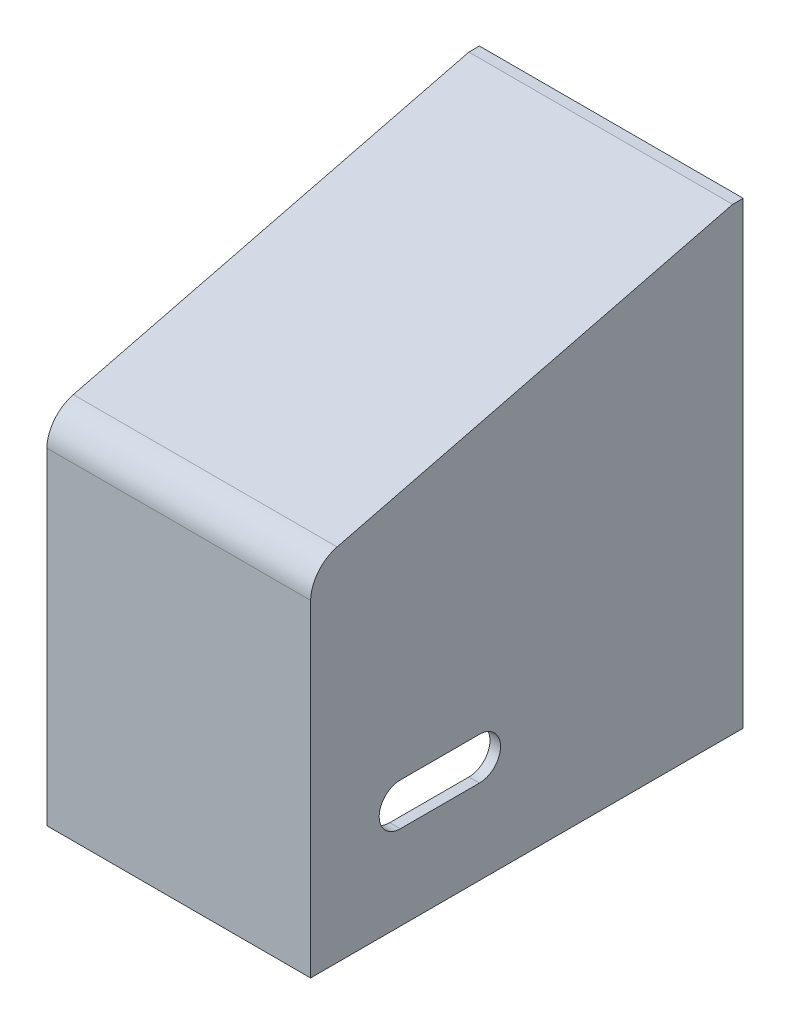
ISO-10303-21;
HEADER;
FILE_DESCRIPTION(('STEP AP214'),'2;1');
FILE_NAME('part.step','',(''),(''),'','','');
FILE_SCHEMA(('AUTOMOTIVE_DESIGN { 1 0 10303 214 1 1 1 1 }'));
ENDSEC;
DATA;
#1=APPLICATION_CONTEXT('core data for automotive mechanical design processes');
#2=APPLICATION_PROTOCOL_DEFINITION('international standard','automotive_design',2000,#1);
#3=PRODUCT_CONTEXT('',#1,'mechanical');
#4=PRODUCT('Part','Part','',(#3));
#5=PRODUCT_RELATED_PRODUCT_CATEGORY('part','',(#4));
#6=PRODUCT_DEFINITION_FORMATION('','',#4);
#7=PRODUCT_DEFINITION_CONTEXT('part definition',#1,'design');
#8=PRODUCT_DEFINITION('design','',#6,#7);
#9=PRODUCT_DEFINITION_SHAPE('','',#8);
#10=(LENGTH_UNIT() NAMED_UNIT(*) SI_UNIT(.MILLI.,.METRE.));
#11=(NAMED_UNIT(*) PLANE_ANGLE_UNIT() SI_UNIT($,.RADIAN.));
#12=(NAMED_UNIT(*) SI_UNIT($,.STERADIAN.) SOLID_ANGLE_UNIT());
#13=UNCERTAINTY_MEASURE_WITH_UNIT(LENGTH_MEASURE(1.E-05),#10,'distance_accuracy_value','');
#14=(GEOMETRIC_REPRESENTATION_CONTEXT(3) GLOBAL_UNCERTAINTY_ASSIGNED_CONTEXT((#13)) GLOBAL_UNIT_ASSIGNED_CONTEXT((#10,
#11,#12)) REPRESENTATION_CONTEXT('',''));
#15=CARTESIAN_POINT('',(0.,0.,0.));
#16=DIRECTION('',(0.,0.,1.));
#17=DIRECTION('',(1.,0.,0.));
#18=AXIS2_PLACEMENT_3D('',#15,#16,#17);
#19=CARTESIAN_POINT('',(0.,0.,2.));
#20=DIRECTION('',(0.,0.,-1.));
#21=DIRECTION('',(-1.,0.,0.));
#22=AXIS2_PLACEMENT_3D('',#19,#20,#21);
#23=PLANE('',#22);
#24=DIRECTION('',(0.,-1.,0.));
#25=VECTOR('',#24,1.);
#26=CARTESIAN_POINT('',(-2.,0.,2.));
#27=LINE('',#26,#25);
#28=CARTESIAN_POINT('',(-2.,85.,2.));
#29=VERTEX_POINT('',#28);
#30=CARTESIAN_POINT('',(-2.,0.,2.));
#31=VERTEX_POINT('',#30);
#32=EDGE_CURVE('E147',#29,#31,#27,.T.);
#33=ORIENTED_EDGE('',*,*,#32,.F.);
#34=DIRECTION('',(-1.,0.,0.));
#35=VECTOR('',#34,1.);
#36=CARTESIAN_POINT('',(0.,85.,2.));
#37=LINE('',#36,#35);
#38=CARTESIAN_POINT('',(0.,85.,2.));
#39=VERTEX_POINT('',#38);
#40=EDGE_CURVE('E12',#39,#29,#37,.T.);
#41=ORIENTED_EDGE('',*,*,#40,.F.);
#42=DIRECTION('',(0.,-1.,0.));
#43=VECTOR('',#42,1.);
#44=CARTESIAN_POINT('',(0.,0.,2.));
#45=LINE('',#44,#43);
#46=CARTESIAN_POINT('',(0.,0.,2.));
#47=VERTEX_POINT('',#46);
#48=EDGE_CURVE('E148',#39,#47,#45,.T.);
#49=ORIENTED_EDGE('',*,*,#48,.T.);
#50=DIRECTION('',(-1.,0.,0.));
#51=VECTOR('',#50,1.);
#52=CARTESIAN_POINT('',(0.,0.,2.));
#53=LINE('',#52,#51);
#54=EDGE_CURVE('E48',#47,#31,#53,.T.);
#55=ORIENTED_EDGE('',*,*,#54,.T.);
#56=EDGE_LOOP('',(#33,#41,#49,#55));
#57=FACE_BOUND('',#56,.T.);
#58=ADVANCED_FACE('F45',(#57),#23,.T.);
#59=CARTESIAN_POINT('',(0.,85.,2.));
#60=DIRECTION('',(0.,0.970142500145332,0.242535625036333));
#61=DIRECTION('',(0.,-0.242535625036333,0.970142500145332));
#62=AXIS2_PLACEMENT_3D('',#59,#60,#61);
#63=PLANE('',#62);
#64=DIRECTION('',(0.,0.242535625036333,-0.970142500145332));
#65=VECTOR('',#64,1.);
#66=CARTESIAN_POINT('',(-2.,85.,2.));
#67=LINE('',#66,#65);
#68=CARTESIAN_POINT('',(-2.,65.5,80.));
#69=VERTEX_POINT('',#68);
#70=EDGE_CURVE('E152',#69,#29,#67,.T.);
#71=ORIENTED_EDGE('',*,*,#70,.F.);
#72=DIRECTION('',(-1.,0.,0.));
#73=VECTOR('',#72,1.);
#74=CARTESIAN_POINT('',(0.,65.5,80.));
#75=LINE('',#74,#73);
#76=CARTESIAN_POINT('',(0.,65.5,80.));
#77=VERTEX_POINT('',#76);
#78=EDGE_CURVE('E53',#77,#69,#75,.T.);
#79=ORIENTED_EDGE('',*,*,#78,.F.);
#80=DIRECTION('',(0.,0.242535625036333,-0.970142500145332));
#81=VECTOR('',#80,1.);
#82=CARTESIAN_POINT('',(0.,85.,2.));
#83=LINE('',#82,#81);
#84=EDGE_CURVE('E158',#77,#39,#83,.T.);
#85=ORIENTED_EDGE('',*,*,#84,.T.);
#86=ORIENTED_EDGE('',*,*,#40,.T.);
#87=EDGE_LOOP('',(#71,#79,#85,#86));
#88=FACE_BOUND('',#87,.T.);
#89=ADVANCED_FACE('F182',(#88),#63,.T.);
#90=CARTESIAN_POINT('',(0.,65.5,80.));
#91=DIRECTION('',(0.,0.,1.));
#92=DIRECTION('',(1.,0.,0.));
#93=AXIS2_PLACEMENT_3D('',#90,#91,#92);
#94=PLANE('',#93);
#95=DIRECTION('',(0.,1.,0.));
#96=VECTOR('',#95,1.);
#97=CARTESIAN_POINT('',(-2.,65.5,80.));
#98=LINE('',#97,#96);
#99=CARTESIAN_POINT('',(-2.,0.,80.));
#100=VERTEX_POINT('',#99);
#101=EDGE_CURVE('E166',#100,#69,#98,.T.);
#102=ORIENTED_EDGE('',*,*,#101,.F.);
#103=DIRECTION('',(-1.,0.,0.));
#104=VECTOR('',#103,1.);
#105=CARTESIAN_POINT('',(0.,0.,80.));
#106=LINE('',#105,#104);
#107=CARTESIAN_POINT('',(0.,0.,80.));
#108=VERTEX_POINT('',#107);
#109=EDGE_CURVE('E171',#108,#100,#106,.T.);
#110=ORIENTED_EDGE('',*,*,#109,.F.);
#111=DIRECTION('',(0.,1.,0.));
#112=VECTOR('',#111,1.);
#113=CARTESIAN_POINT('',(0.,65.5,80.));
#114=LINE('',#113,#112);
#115=EDGE_CURVE('E155',#108,#77,#114,.T.);
#116=ORIENTED_EDGE('',*,*,#115,.T.);
#117=ORIENTED_EDGE('',*,*,#78,.T.);
#118=EDGE_LOOP('',(#102,#110,#116,#117));
#119=FACE_BOUND('',#118,.T.);
#120=ADVANCED_FACE('F188',(#119),#94,.T.);
#121=CARTESIAN_POINT('',(0.,0.,80.));
#122=DIRECTION('',(0.,-1.,0.));
#123=DIRECTION('',(0.,0.,-1.));
#124=AXIS2_PLACEMENT_3D('',#121,#122,#123);
#125=PLANE('',#124);
#126=DIRECTION('',(0.,0.,1.));
#127=VECTOR('',#126,1.);
#128=CARTESIAN_POINT('',(-2.,0.,80.));
#129=LINE('',#128,#127);
#130=EDGE_CURVE('E163',#31,#100,#129,.T.);
#131=ORIENTED_EDGE('',*,*,#130,.F.);
#132=ORIENTED_EDGE('',*,*,#54,.F.);
#133=DIRECTION('',(0.,0.,1.));
#134=VECTOR('',#133,1.);
#135=CARTESIAN_POINT('',(0.,0.,80.));
#136=LINE('',#135,#134);
#137=EDGE_CURVE('E151',#47,#108,#136,.T.);
#138=ORIENTED_EDGE('',*,*,#137,.T.);
#139=ORIENTED_EDGE('',*,*,#109,.T.);
#140=EDGE_LOOP('',(#131,#132,#138,#139));
#141=FACE_BOUND('',#140,.T.);
#142=ADVANCED_FACE('F179',(#141),#125,.T.);
#143=CARTESIAN_POINT('',(0.,0.,0.));
#144=DIRECTION('',(-1.,0.,0.));
#145=DIRECTION('',(0.,0.,1.));
#146=AXIS2_PLACEMENT_3D('',#143,#144,#145);
#147=PLANE('',#146);
#148=DIRECTION('',(0.,0.,-1.));
#149=VECTOR('',#148,1.);
#150=CARTESIAN_POINT('',(0.,24.,0.));
#151=LINE('',#150,#149);
#152=CARTESIAN_POINT('',(0.,24.,65.));
#153=VERTEX_POINT('',#152);
#154=CARTESIAN_POINT('',(0.,24.,50.));
#155=VERTEX_POINT('',#154);
#156=EDGE_CURVE('E141',#153,#155,#151,.T.);
#157=ORIENTED_EDGE('',*,*,#156,.T.);
#158=CARTESIAN_POINT('',(0.,20.,50.));
#159=DIRECTION('',(-1.,0.,0.));
#160=DIRECTION('',(0.,0.,1.));
#161=AXIS2_PLACEMENT_3D('',#158,#159,#160);
#162=CIRCLE('',#161,4.00000000000001);
#163=CARTESIAN_POINT('',(0.,16.,50.));
#164=VERTEX_POINT('',#163);
#165=EDGE_CURVE('E144',#155,#164,#162,.T.);
#166=ORIENTED_EDGE('',*,*,#165,.T.);
#167=DIRECTION('',(0.,0.,1.));
#168=VECTOR('',#167,1.);
#169=CARTESIAN_POINT('',(0.,16.,0.));
#170=LINE('',#169,#168);
#171=CARTESIAN_POINT('',(0.,16.,65.));
#172=VERTEX_POINT('',#171);
#173=EDGE_CURVE('E136',#164,#172,#170,.T.);
#174=ORIENTED_EDGE('',*,*,#173,.T.);
#175=CARTESIAN_POINT('',(0.,20.,65.));
#176=DIRECTION('',(-1.,0.,0.));
#177=DIRECTION('',(0.,0.,1.));
#178=AXIS2_PLACEMENT_3D('',#175,#176,#177);
#179=CIRCLE('',#178,4.00000000000001);
#180=EDGE_CURVE('E116',#172,#153,#179,.T.);
#181=ORIENTED_EDGE('',*,*,#180,.T.);
#182=EDGE_LOOP('',(#157,#166,#174,#181));
#183=FACE_BOUND('',#182,.T.);
#184=ORIENTED_EDGE('',*,*,#48,.F.);
#185=ORIENTED_EDGE('',*,*,#84,.F.);
#186=ORIENTED_EDGE('',*,*,#115,.F.);
#187=ORIENTED_EDGE('',*,*,#137,.F.);
#188=EDGE_LOOP('',(#184,#185,#186,#187));
#189=FACE_BOUND('',#188,.T.);
#190=ADVANCED_FACE('F185',(#183,#189),#147,.F.);
#191=CARTESIAN_POINT('',(-2.,0.,0.));
#192=DIRECTION('',(-1.,0.,0.));
#193=DIRECTION('',(0.,0.,1.));
#194=AXIS2_PLACEMENT_3D('',#191,#192,#193);
#195=PLANE('',#194);
#196=CARTESIAN_POINT('',(-2.,20.,50.));
#197=DIRECTION('',(-1.,0.,0.));
#198=DIRECTION('',(0.,0.,1.));
#199=AXIS2_PLACEMENT_3D('',#196,#197,#198);
#200=CIRCLE('',#199,4.00000000000001);
#201=CARTESIAN_POINT('',(-2.,24.,50.));
#202=VERTEX_POINT('',#201);
#203=CARTESIAN_POINT('',(-2.,16.,50.));
#204=VERTEX_POINT('',#203);
#205=EDGE_CURVE('E69',#202,#204,#200,.T.);
#206=ORIENTED_EDGE('',*,*,#205,.F.);
#207=DIRECTION('',(0.,0.,-1.));
#208=VECTOR('',#207,1.);
#209=CARTESIAN_POINT('',(-2.,24.,50.));
#210=LINE('',#209,#208);
#211=CARTESIAN_POINT('',(-2.,24.,65.));
#212=VERTEX_POINT('',#211);
#213=EDGE_CURVE('E129',#212,#202,#210,.T.);
#214=ORIENTED_EDGE('',*,*,#213,.F.);
#215=CARTESIAN_POINT('',(-2.,20.,65.));
#216=DIRECTION('',(-1.,0.,0.));
#217=DIRECTION('',(0.,0.,1.));
#218=AXIS2_PLACEMENT_3D('',#215,#216,#217);
#219=CIRCLE('',#218,4.00000000000001);
#220=CARTESIAN_POINT('',(-2.,16.,65.));
#221=VERTEX_POINT('',#220);
#222=EDGE_CURVE('E113',#221,#212,#219,.T.);
#223=ORIENTED_EDGE('',*,*,#222,.F.);
#224=DIRECTION('',(0.,0.,1.));
#225=VECTOR('',#224,1.);
#226=CARTESIAN_POINT('',(-2.,16.,50.));
#227=LINE('',#226,#225);
#228=EDGE_CURVE('E122',#204,#221,#227,.T.);
#229=ORIENTED_EDGE('',*,*,#228,.F.);
#230=EDGE_LOOP('',(#206,#214,#223,#229));
#231=FACE_BOUND('',#230,.T.);
#232=ORIENTED_EDGE('',*,*,#32,.T.);
#233=ORIENTED_EDGE('',*,*,#130,.T.);
#234=ORIENTED_EDGE('',*,*,#101,.T.);
#235=ORIENTED_EDGE('',*,*,#70,.T.);
#236=EDGE_LOOP('',(#232,#233,#234,#235));
#237=FACE_BOUND('',#236,.T.);
#238=ADVANCED_FACE('F126',(#231,#237),#195,.T.);
#239=CARTESIAN_POINT('',(48.,20.,50.));
#240=DIRECTION('',(-1.,0.,0.));
#241=DIRECTION('',(0.,0.,1.));
#242=AXIS2_PLACEMENT_3D('',#239,#240,#241);
#243=CYLINDRICAL_SURFACE('',#242,4.00000000000001);
#244=DIRECTION('',(-1.,0.,0.));
#245=VECTOR('',#244,1.);
#246=CARTESIAN_POINT('',(48.,24.,50.));
#247=LINE('',#246,#245);
#248=EDGE_CURVE('E134',#155,#202,#247,.T.);
#249=ORIENTED_EDGE('',*,*,#248,.T.);
#250=ORIENTED_EDGE('',*,*,#205,.T.);
#251=DIRECTION('',(-1.,0.,0.));
#252=VECTOR('',#251,1.);
#253=CARTESIAN_POINT('',(48.,16.,50.));
#254=LINE('',#253,#252);
#255=EDGE_CURVE('E119',#164,#204,#254,.T.);
#256=ORIENTED_EDGE('',*,*,#255,.F.);
#257=ORIENTED_EDGE('',*,*,#165,.F.);
#258=EDGE_LOOP('',(#249,#250,#256,#257));
#259=FACE_BOUND('',#258,.T.);
#260=ADVANCED_FACE('F228',(#259),#243,.F.);
#261=CARTESIAN_POINT('',(48.,24.,50.));
#262=DIRECTION('',(0.,1.,0.));
#263=DIRECTION('',(0.,0.,1.));
#264=AXIS2_PLACEMENT_3D('',#261,#262,#263);
#265=PLANE('',#264);
#266=DIRECTION('',(-1.,0.,0.));
#267=VECTOR('',#266,1.);
#268=CARTESIAN_POINT('',(48.,24.,65.));
#269=LINE('',#268,#267);
#270=EDGE_CURVE('E118',#153,#212,#269,.T.);
#271=ORIENTED_EDGE('',*,*,#270,.T.);
#272=ORIENTED_EDGE('',*,*,#213,.T.);
#273=ORIENTED_EDGE('',*,*,#248,.F.);
#274=ORIENTED_EDGE('',*,*,#156,.F.);
#275=EDGE_LOOP('',(#271,#272,#273,#274));
#276=FACE_BOUND('',#275,.T.);
#277=ADVANCED_FACE('F236',(#276),#265,.F.);
#278=CARTESIAN_POINT('',(48.,20.,65.));
#279=DIRECTION('',(-1.,0.,0.));
#280=DIRECTION('',(0.,0.,1.));
#281=AXIS2_PLACEMENT_3D('',#278,#279,#280);
#282=CYLINDRICAL_SURFACE('',#281,4.00000000000001);
#283=DIRECTION('',(-1.,0.,0.));
#284=VECTOR('',#283,1.);
#285=CARTESIAN_POINT('',(48.,16.,65.));
#286=LINE('',#285,#284);
#287=EDGE_CURVE('E61',#172,#221,#286,.T.);
#288=ORIENTED_EDGE('',*,*,#287,.T.);
#289=ORIENTED_EDGE('',*,*,#222,.T.);
#290=ORIENTED_EDGE('',*,*,#270,.F.);
#291=ORIENTED_EDGE('',*,*,#180,.F.);
#292=EDGE_LOOP('',(#288,#289,#290,#291));
#293=FACE_BOUND('',#292,.T.);
#294=ADVANCED_FACE('F110',(#293),#282,.F.);
#295=CARTESIAN_POINT('',(48.,16.,50.));
#296=DIRECTION('',(0.,-1.,0.));
#297=DIRECTION('',(0.,0.,-1.));
#298=AXIS2_PLACEMENT_3D('',#295,#296,#297);
#299=PLANE('',#298);
#300=ORIENTED_EDGE('',*,*,#255,.T.);
#301=ORIENTED_EDGE('',*,*,#228,.T.);
#302=ORIENTED_EDGE('',*,*,#287,.F.);
#303=ORIENTED_EDGE('',*,*,#173,.F.);
#304=EDGE_LOOP('',(#300,#301,#302,#303));
#305=FACE_BOUND('',#304,.T.);
#306=ADVANCED_FACE('F123',(#305),#299,.F.);
#307=CLOSED_SHELL('',(#58,#89,#120,#142,#190,#238,#260,#277,#294,#306));
#308=MANIFOLD_SOLID_BREP('B2',#307);
#309=CARTESIAN_POINT('',(48.,67.,82.));
#310=DIRECTION('',(-1.,0.,0.));
#311=DIRECTION('',(0.,-1.,0.));
#312=AXIS2_PLACEMENT_3D('',#309,#310,#311);
#313=PLANE('',#312);
#314=DIRECTION('',(0.,0.,-1.));
#315=VECTOR('',#314,1.);
#316=CARTESIAN_POINT('',(48.,24.,50.));
#317=LINE('',#316,#315);
#318=CARTESIAN_POINT('',(48.,24.,65.));
#319=VERTEX_POINT('',#318);
#320=CARTESIAN_POINT('',(48.,24.,50.));
#321=VERTEX_POINT('',#320);
#322=EDGE_CURVE('E398',#319,#321,#317,.T.);
#323=ORIENTED_EDGE('',*,*,#322,.T.);
#324=CARTESIAN_POINT('',(48.,20.,50.));
#325=DIRECTION('',(-1.,0.,0.));
#326=DIRECTION('',(0.,0.,1.));
#327=AXIS2_PLACEMENT_3D('',#324,#325,#326);
#328=CIRCLE('',#327,4.00000000000001);
#329=CARTESIAN_POINT('',(48.,16.,50.));
#330=VERTEX_POINT('',#329);
#331=EDGE_CURVE('E394',#321,#330,#328,.T.);
#332=ORIENTED_EDGE('',*,*,#331,.T.);
#333=DIRECTION('',(0.,0.,1.));
#334=VECTOR('',#333,1.);
#335=CARTESIAN_POINT('',(48.,16.,50.));
#336=LINE('',#335,#334);
#337=CARTESIAN_POINT('',(48.,16.,65.));
#338=VERTEX_POINT('',#337);
#339=EDGE_CURVE('E401',#330,#338,#336,.T.);
#340=ORIENTED_EDGE('',*,*,#339,.T.);
#341=CARTESIAN_POINT('',(48.,20.,65.));
#342=DIRECTION('',(-1.,0.,0.));
#343=DIRECTION('',(0.,0.,1.));
#344=AXIS2_PLACEMENT_3D('',#341,#342,#343);
#345=CIRCLE('',#344,4.00000000000001);
#346=EDGE_CURVE('E290',#338,#319,#345,.T.);
#347=ORIENTED_EDGE('',*,*,#346,.T.);
#348=EDGE_LOOP('',(#323,#332,#340,#347));
#349=FACE_BOUND('',#348,.T.);
#350=DIRECTION('',(0.,0.242535625036333,-0.970142500145332));
#351=VECTOR('',#350,1.);
#352=CARTESIAN_POINT('',(48.,87.,2.));
#353=LINE('',#352,#351);
#354=CARTESIAN_POINT('',(48.,68.2566302671495,76.9734789314022));
#355=VERTEX_POINT('',#354);
#356=CARTESIAN_POINT('',(48.,87.,2.));
#357=VERTEX_POINT('',#356);
#358=EDGE_CURVE('E482',#355,#357,#353,.T.);
#359=ORIENTED_EDGE('',*,*,#358,.F.);
#360=CARTESIAN_POINT('',(48.,61.8154966318627,75.3631955225806));
#361=DIRECTION('',(-1.,0.,0.));
#362=DIRECTION('',(0.,1.,0.));
#363=AXIS2_PLACEMENT_3D('',#360,#361,#362);
#364=CIRCLE('',#363,6.63936858175149);
#365=CARTESIAN_POINT('',(48.,62.,82.));
#366=VERTEX_POINT('',#365);
#367=EDGE_CURVE('E413',#366,#355,#364,.T.);
#368=ORIENTED_EDGE('',*,*,#367,.F.);
#369=DIRECTION('',(0.,1.,0.));
#370=VECTOR('',#369,1.);
#371=CARTESIAN_POINT('',(48.,67.,82.));
#372=LINE('',#371,#370);
#373=CARTESIAN_POINT('',(48.,0.,82.));
#374=VERTEX_POINT('',#373);
#375=EDGE_CURVE('E498',#374,#366,#372,.T.);
#376=ORIENTED_EDGE('',*,*,#375,.F.);
#377=DIRECTION('',(0.,0.,-1.));
#378=VECTOR('',#377,1.);
#379=CARTESIAN_POINT('',(48.,0.,82.));
#380=LINE('',#379,#378);
#381=CARTESIAN_POINT('',(48.,0.,0.));
#382=VERTEX_POINT('',#381);
#383=EDGE_CURVE('E510',#374,#382,#380,.T.);
#384=ORIENTED_EDGE('',*,*,#383,.T.);
#385=DIRECTION('',(0.,1.,0.));
#386=VECTOR('',#385,1.);
#387=CARTESIAN_POINT('',(48.,0.,0.));
#388=LINE('',#387,#386);
#389=CARTESIAN_POINT('',(48.,87.,0.));
#390=VERTEX_POINT('',#389);
#391=EDGE_CURVE('E456',#382,#390,#388,.T.);
#392=ORIENTED_EDGE('',*,*,#391,.T.);
#393=DIRECTION('',(0.,0.,-1.));
#394=VECTOR('',#393,1.);
#395=CARTESIAN_POINT('',(48.,87.,2.));
#396=LINE('',#395,#394);
#397=EDGE_CURVE('E466',#357,#390,#396,.T.);
#398=ORIENTED_EDGE('',*,*,#397,.F.);
#399=EDGE_LOOP('',(#359,#368,#376,#384,#392,#398));
#400=FACE_BOUND('',#399,.T.);
#401=ADVANCED_FACE('F275',(#349,#400),#313,.F.);
#402=CARTESIAN_POINT('',(-2.,0.,82.));
#403=DIRECTION('',(1.,0.,0.));
#404=DIRECTION('',(0.,0.,-1.));
#405=AXIS2_PLACEMENT_3D('',#402,#403,#404);
#406=PLANE('',#405);
#407=DIRECTION('',(0.,-1.,0.));
#408=VECTOR('',#407,1.);
#409=CARTESIAN_POINT('',(-2.,65.,82.));
#410=LINE('',#409,#408);
#411=CARTESIAN_POINT('',(-2.00000000000001,62.,82.));
#412=VERTEX_POINT('',#411);
#413=CARTESIAN_POINT('',(-2.,0.,82.));
#414=VERTEX_POINT('',#413);
#415=EDGE_CURVE('E502',#412,#414,#410,.T.);
#416=ORIENTED_EDGE('',*,*,#415,.F.);
#417=CARTESIAN_POINT('',(-2.00000000000001,61.8154966318627,75.3631955225806));
#418=DIRECTION('',(-1.,0.,0.));
#419=DIRECTION('',(0.,1.,0.));
#420=AXIS2_PLACEMENT_3D('',#417,#418,#419);
#421=CIRCLE('',#420,6.63936858175149);
#422=CARTESIAN_POINT('',(-2.00000000000001,68.2566302671495,76.9734789314022));
#423=VERTEX_POINT('',#422);
#424=EDGE_CURVE('E418',#412,#423,#421,.T.);
#425=ORIENTED_EDGE('',*,*,#424,.T.);
#426=DIRECTION('',(0.,0.242535625036333,-0.970142500145332));
#427=VECTOR('',#426,1.);
#428=CARTESIAN_POINT('',(-2.,87.,2.));
#429=LINE('',#428,#427);
#430=CARTESIAN_POINT('',(-2.,87.,2.));
#431=VERTEX_POINT('',#430);
#432=EDGE_CURVE('E485',#423,#431,#429,.T.);
#433=ORIENTED_EDGE('',*,*,#432,.T.);
#434=DIRECTION('',(0.,0.,-1.));
#435=VECTOR('',#434,1.);
#436=CARTESIAN_POINT('',(-2.,87.,2.));
#437=LINE('',#436,#435);
#438=CARTESIAN_POINT('',(-2.,87.,0.));
#439=VERTEX_POINT('',#438);
#440=EDGE_CURVE('E463',#431,#439,#437,.T.);
#441=ORIENTED_EDGE('',*,*,#440,.T.);
#442=DIRECTION('',(0.,-1.,0.));
#443=VECTOR('',#442,1.);
#444=CARTESIAN_POINT('',(-2.,87.,0.));
#445=LINE('',#444,#443);
#446=CARTESIAN_POINT('',(-2.,0.,0.));
#447=VERTEX_POINT('',#446);
#448=EDGE_CURVE('E437',#439,#447,#445,.T.);
#449=ORIENTED_EDGE('',*,*,#448,.T.);
#450=DIRECTION('',(0.,0.,-1.));
#451=VECTOR('',#450,1.);
#452=CARTESIAN_POINT('',(-2.,0.,2.));
#453=LINE('',#452,#451);
#454=CARTESIAN_POINT('',(-2.,0.,2.));
#455=VERTEX_POINT('',#454);
#456=EDGE_CURVE('E444',#455,#447,#453,.T.);
#457=ORIENTED_EDGE('',*,*,#456,.F.);
#458=DIRECTION('',(0.,-1.,0.));
#459=VECTOR('',#458,1.);
#460=CARTESIAN_POINT('',(-2.,87.,2.));
#461=LINE('',#460,#459);
#462=CARTESIAN_POINT('',(-2.,85.,2.));
#463=VERTEX_POINT('',#462);
#464=EDGE_CURVE('E442',#463,#455,#461,.T.);
#465=ORIENTED_EDGE('',*,*,#464,.F.);
#466=DIRECTION('',(0.,-0.242535625036333,0.970142500145332));
#467=VECTOR('',#466,1.);
#468=CARTESIAN_POINT('',(-2.,65.,82.));
#469=LINE('',#468,#467);
#470=CARTESIAN_POINT('',(-2.,65.5,80.));
#471=VERTEX_POINT('',#470);
#472=EDGE_CURVE('E481',#463,#471,#469,.T.);
#473=ORIENTED_EDGE('',*,*,#472,.T.);
#474=DIRECTION('',(0.,-1.,0.));
#475=VECTOR('',#474,1.);
#476=CARTESIAN_POINT('',(-2.,0.,80.));
#477=LINE('',#476,#475);
#478=CARTESIAN_POINT('',(-2.,0.,80.));
#479=VERTEX_POINT('',#478);
#480=EDGE_CURVE('E499',#471,#479,#477,.T.);
#481=ORIENTED_EDGE('',*,*,#480,.T.);
#482=DIRECTION('',(0.,0.,-1.));
#483=VECTOR('',#482,1.);
#484=CARTESIAN_POINT('',(-2.,0.,82.));
#485=LINE('',#484,#483);
#486=EDGE_CURVE('E504',#414,#479,#485,.T.);
#487=ORIENTED_EDGE('',*,*,#486,.F.);
#488=EDGE_LOOP('',(#416,#425,#433,#441,#449,#457,#465,#473,#481,#487));
#489=FACE_BOUND('',#488,.T.);
#490=ADVANCED_FACE('F534',(#489),#406,.F.);
#491=CARTESIAN_POINT('',(0.,0.,80.));
#492=DIRECTION('',(0.,0.,-1.));
#493=DIRECTION('',(-1.,0.,0.));
#494=AXIS2_PLACEMENT_3D('',#491,#492,#493);
#495=PLANE('',#494);
#496=DIRECTION('',(-1.,0.,0.));
#497=VECTOR('',#496,1.);
#498=CARTESIAN_POINT('',(0.,65.5,80.));
#499=LINE('',#498,#497);
#500=CARTESIAN_POINT('',(46.,65.5,80.));
#501=VERTEX_POINT('',#500);
#502=EDGE_CURVE('E512',#501,#471,#499,.T.);
#503=ORIENTED_EDGE('',*,*,#502,.F.);
#504=DIRECTION('',(0.,-1.,0.));
#505=VECTOR('',#504,1.);
#506=CARTESIAN_POINT('',(46.,0.,80.));
#507=LINE('',#506,#505);
#508=CARTESIAN_POINT('',(46.,0.,80.));
#509=VERTEX_POINT('',#508);
#510=EDGE_CURVE('E426',#501,#509,#507,.T.);
#511=ORIENTED_EDGE('',*,*,#510,.T.);
#512=DIRECTION('',(1.,0.,0.));
#513=VECTOR('',#512,1.);
#514=CARTESIAN_POINT('',(-2.,0.,80.));
#515=LINE('',#514,#513);
#516=EDGE_CURVE('E492',#479,#509,#515,.T.);
#517=ORIENTED_EDGE('',*,*,#516,.F.);
#518=ORIENTED_EDGE('',*,*,#480,.F.);
#519=EDGE_LOOP('',(#503,#511,#517,#518));
#520=FACE_BOUND('',#519,.T.);
#521=ADVANCED_FACE('F540',(#520),#495,.T.);
#522=CARTESIAN_POINT('',(48.,65.,82.));
#523=DIRECTION('',(0.,-0.970142500145332,-0.242535625036333));
#524=DIRECTION('',(0.,0.242535625036333,-0.970142500145332));
#525=AXIS2_PLACEMENT_3D('',#522,#523,#524);
#526=PLANE('',#525);
#527=DIRECTION('',(1.,0.,0.));
#528=VECTOR('',#527,1.);
#529=CARTESIAN_POINT('',(0.,85.,2.));
#530=LINE('',#529,#528);
#531=CARTESIAN_POINT('',(0.,85.,2.));
#532=VERTEX_POINT('',#531);
#533=CARTESIAN_POINT('',(46.,85.,2.));
#534=VERTEX_POINT('',#533);
#535=EDGE_CURVE('E440',#532,#534,#530,.T.);
#536=ORIENTED_EDGE('',*,*,#535,.T.);
#537=DIRECTION('',(0.,-0.242535625036333,0.970142500145332));
#538=VECTOR('',#537,1.);
#539=CARTESIAN_POINT('',(46.,65.5,80.));
#540=LINE('',#539,#538);
#541=EDGE_CURVE('E430',#534,#501,#540,.T.);
#542=ORIENTED_EDGE('',*,*,#541,.T.);
#543=ORIENTED_EDGE('',*,*,#502,.T.);
#544=ORIENTED_EDGE('',*,*,#472,.F.);
#545=DIRECTION('',(-1.,0.,0.));
#546=VECTOR('',#545,1.);
#547=CARTESIAN_POINT('',(48.,85.,2.));
#548=LINE('',#547,#546);
#549=EDGE_CURVE('E484',#532,#463,#548,.T.);
#550=ORIENTED_EDGE('',*,*,#549,.F.);
#551=EDGE_LOOP('',(#536,#542,#543,#544,#550));
#552=FACE_BOUND('',#551,.T.);
#553=ADVANCED_FACE('F546',(#552),#526,.T.);
#554=CARTESIAN_POINT('',(-2.,0.,82.));
#555=DIRECTION('',(0.,1.,0.));
#556=DIRECTION('',(0.,0.,1.));
#557=AXIS2_PLACEMENT_3D('',#554,#555,#556);
#558=PLANE('',#557);
#559=ORIENTED_EDGE('',*,*,#516,.T.);
#560=DIRECTION('',(0.,0.,-1.));
#561=VECTOR('',#560,1.);
#562=CARTESIAN_POINT('',(46.,0.,2.));
#563=LINE('',#562,#561);
#564=CARTESIAN_POINT('',(46.,0.,0.));
#565=VERTEX_POINT('',#564);
#566=EDGE_CURVE('E469',#509,#565,#563,.T.);
#567=ORIENTED_EDGE('',*,*,#566,.T.);
#568=DIRECTION('',(1.,0.,0.));
#569=VECTOR('',#568,1.);
#570=CARTESIAN_POINT('',(48.,0.,0.));
#571=LINE('',#570,#569);
#572=EDGE_CURVE('E453',#565,#382,#571,.T.);
#573=ORIENTED_EDGE('',*,*,#572,.T.);
#574=ORIENTED_EDGE('',*,*,#383,.F.);
#575=DIRECTION('',(1.,0.,0.));
#576=VECTOR('',#575,1.);
#577=CARTESIAN_POINT('',(-2.,0.,82.));
#578=LINE('',#577,#576);
#579=EDGE_CURVE('E495',#414,#374,#578,.T.);
#580=ORIENTED_EDGE('',*,*,#579,.F.);
#581=ORIENTED_EDGE('',*,*,#486,.T.);
#582=EDGE_LOOP('',(#559,#567,#573,#574,#580,#581));
#583=FACE_BOUND('',#582,.T.);
#584=ADVANCED_FACE('F277',(#583),#558,.F.);
#585=CARTESIAN_POINT('',(0.,0.,82.));
#586=DIRECTION('',(0.,0.,-1.));
#587=DIRECTION('',(-1.,0.,0.));
#588=AXIS2_PLACEMENT_3D('',#585,#586,#587);
#589=PLANE('',#588);
#590=ORIENTED_EDGE('',*,*,#375,.T.);
#591=DIRECTION('',(1.,0.,0.));
#592=VECTOR('',#591,1.);
#593=CARTESIAN_POINT('',(-2.00000000000001,62.,82.));
#594=LINE('',#593,#592);
#595=EDGE_CURVE('E421',#412,#366,#594,.T.);
#596=ORIENTED_EDGE('',*,*,#595,.F.);
#597=ORIENTED_EDGE('',*,*,#415,.T.);
#598=ORIENTED_EDGE('',*,*,#579,.T.);
#599=EDGE_LOOP('',(#590,#596,#597,#598));
#600=FACE_BOUND('',#599,.T.);
#601=ADVANCED_FACE('F548',(#600),#589,.F.);
#602=CARTESIAN_POINT('',(48.,87.,2.));
#603=DIRECTION('',(0.,0.970142500145332,0.242535625036333));
#604=DIRECTION('',(0.,-0.242535625036333,0.970142500145332));
#605=AXIS2_PLACEMENT_3D('',#602,#603,#604);
#606=PLANE('',#605);
#607=DIRECTION('',(1.,0.,0.));
#608=VECTOR('',#607,1.);
#609=CARTESIAN_POINT('',(-2.00000000000001,68.2566302671495,76.9734789314022));
#610=LINE('',#609,#608);
#611=EDGE_CURVE('E423',#423,#355,#610,.T.);
#612=ORIENTED_EDGE('',*,*,#611,.T.);
#613=ORIENTED_EDGE('',*,*,#358,.T.);
#614=DIRECTION('',(-1.,0.,0.));
#615=VECTOR('',#614,1.);
#616=CARTESIAN_POINT('',(48.,87.,2.));
#617=LINE('',#616,#615);
#618=EDGE_CURVE('E489',#357,#431,#617,.T.);
#619=ORIENTED_EDGE('',*,*,#618,.T.);
#620=ORIENTED_EDGE('',*,*,#432,.F.);
#621=EDGE_LOOP('',(#612,#613,#619,#620));
#622=FACE_BOUND('',#621,.T.);
#623=ADVANCED_FACE('F551',(#622),#606,.T.);
#624=CARTESIAN_POINT('',(-2.,0.,2.));
#625=DIRECTION('',(0.,1.,0.));
#626=DIRECTION('',(0.,0.,1.));
#627=AXIS2_PLACEMENT_3D('',#624,#625,#626);
#628=PLANE('',#627);
#629=DIRECTION('',(1.,0.,0.));
#630=VECTOR('',#629,1.);
#631=CARTESIAN_POINT('',(-2.,0.,0.));
#632=LINE('',#631,#630);
#633=CARTESIAN_POINT('',(0.,0.,0.));
#634=VERTEX_POINT('',#633);
#635=EDGE_CURVE('E432',#447,#634,#632,.T.);
#636=ORIENTED_EDGE('',*,*,#635,.T.);
#637=DIRECTION('',(0.,0.,-1.));
#638=VECTOR('',#637,1.);
#639=CARTESIAN_POINT('',(0.,0.,2.));
#640=LINE('',#639,#638);
#641=CARTESIAN_POINT('',(0.,0.,2.));
#642=VERTEX_POINT('',#641);
#643=EDGE_CURVE('E478',#642,#634,#640,.T.);
#644=ORIENTED_EDGE('',*,*,#643,.F.);
#645=DIRECTION('',(1.,0.,0.));
#646=VECTOR('',#645,1.);
#647=CARTESIAN_POINT('',(-2.,0.,2.));
#648=LINE('',#647,#646);
#649=EDGE_CURVE('E433',#455,#642,#648,.T.);
#650=ORIENTED_EDGE('',*,*,#649,.F.);
#651=ORIENTED_EDGE('',*,*,#456,.T.);
#652=EDGE_LOOP('',(#636,#644,#650,#651));
#653=FACE_BOUND('',#652,.T.);
#654=ADVANCED_FACE('F558',(#653),#628,.F.);
#655=CARTESIAN_POINT('',(0.,0.,2.));
#656=DIRECTION('',(-1.,0.,0.));
#657=DIRECTION('',(0.,0.,1.));
#658=AXIS2_PLACEMENT_3D('',#655,#656,#657);
#659=PLANE('',#658);
#660=DIRECTION('',(0.,1.,0.));
#661=VECTOR('',#660,1.);
#662=CARTESIAN_POINT('',(0.,0.,0.));
#663=LINE('',#662,#661);
#664=CARTESIAN_POINT('',(0.,85.,0.));
#665=VERTEX_POINT('',#664);
#666=EDGE_CURVE('E447',#634,#665,#663,.T.);
#667=ORIENTED_EDGE('',*,*,#666,.T.);
#668=DIRECTION('',(0.,0.,-1.));
#669=VECTOR('',#668,1.);
#670=CARTESIAN_POINT('',(0.,85.,2.));
#671=LINE('',#670,#669);
#672=EDGE_CURVE('E475',#532,#665,#671,.T.);
#673=ORIENTED_EDGE('',*,*,#672,.F.);
#674=DIRECTION('',(0.,1.,0.));
#675=VECTOR('',#674,1.);
#676=CARTESIAN_POINT('',(0.,0.,2.));
#677=LINE('',#676,#675);
#678=EDGE_CURVE('E436',#642,#532,#677,.T.);
#679=ORIENTED_EDGE('',*,*,#678,.F.);
#680=ORIENTED_EDGE('',*,*,#643,.T.);
#681=EDGE_LOOP('',(#667,#673,#679,#680));
#682=FACE_BOUND('',#681,.T.);
#683=ADVANCED_FACE('F562',(#682),#659,.F.);
#684=CARTESIAN_POINT('',(0.,85.,2.));
#685=DIRECTION('',(0.,1.,0.));
#686=DIRECTION('',(0.,0.,1.));
#687=AXIS2_PLACEMENT_3D('',#684,#685,#686);
#688=PLANE('',#687);
#689=DIRECTION('',(1.,0.,0.));
#690=VECTOR('',#689,1.);
#691=CARTESIAN_POINT('',(0.,85.,0.));
#692=LINE('',#691,#690);
#693=CARTESIAN_POINT('',(46.,85.,0.));
#694=VERTEX_POINT('',#693);
#695=EDGE_CURVE('E449',#665,#694,#692,.T.);
#696=ORIENTED_EDGE('',*,*,#695,.T.);
#697=DIRECTION('',(0.,0.,-1.));
#698=VECTOR('',#697,1.);
#699=CARTESIAN_POINT('',(46.,85.,2.));
#700=LINE('',#699,#698);
#701=EDGE_CURVE('E472',#534,#694,#700,.T.);
#702=ORIENTED_EDGE('',*,*,#701,.F.);
#703=ORIENTED_EDGE('',*,*,#535,.F.);
#704=ORIENTED_EDGE('',*,*,#672,.T.);
#705=EDGE_LOOP('',(#696,#702,#703,#704));
#706=FACE_BOUND('',#705,.T.);
#707=ADVANCED_FACE('F566',(#706),#688,.F.);
#708=CARTESIAN_POINT('',(46.,85.,2.));
#709=DIRECTION('',(1.,0.,0.));
#710=DIRECTION('',(0.,1.,0.));
#711=AXIS2_PLACEMENT_3D('',#708,#709,#710);
#712=PLANE('',#711);
#713=DIRECTION('',(0.,0.,-1.));
#714=VECTOR('',#713,1.);
#715=CARTESIAN_POINT('',(46.,16.,2.));
#716=LINE('',#715,#714);
#717=CARTESIAN_POINT('',(46.,16.,65.));
#718=VERTEX_POINT('',#717);
#719=CARTESIAN_POINT('',(46.,16.,50.));
#720=VERTEX_POINT('',#719);
#721=EDGE_CURVE('E514',#718,#720,#716,.T.);
#722=ORIENTED_EDGE('',*,*,#721,.T.);
#723=CARTESIAN_POINT('',(46.,20.,50.));
#724=DIRECTION('',(1.,0.,0.));
#725=DIRECTION('',(0.,1.,0.));
#726=AXIS2_PLACEMENT_3D('',#723,#724,#725);
#727=CIRCLE('',#726,4.00000000000001);
#728=CARTESIAN_POINT('',(46.,24.,50.));
#729=VERTEX_POINT('',#728);
#730=EDGE_CURVE('E43',#720,#729,#727,.T.);
#731=ORIENTED_EDGE('',*,*,#730,.T.);
#732=DIRECTION('',(0.,0.,1.));
#733=VECTOR('',#732,1.);
#734=CARTESIAN_POINT('',(46.,24.,2.));
#735=LINE('',#734,#733);
#736=CARTESIAN_POINT('',(46.,24.,65.));
#737=VERTEX_POINT('',#736);
#738=EDGE_CURVE('E283',#729,#737,#735,.T.);
#739=ORIENTED_EDGE('',*,*,#738,.T.);
#740=CARTESIAN_POINT('',(46.,20.,65.));
#741=DIRECTION('',(1.,0.,0.));
#742=DIRECTION('',(0.,1.,0.));
#743=AXIS2_PLACEMENT_3D('',#740,#741,#742);
#744=CIRCLE('',#743,4.00000000000001);
#745=EDGE_CURVE('E516',#737,#718,#744,.T.);
#746=ORIENTED_EDGE('',*,*,#745,.T.);
#747=EDGE_LOOP('',(#722,#731,#739,#746));
#748=FACE_BOUND('',#747,.T.);
#749=DIRECTION('',(0.,-1.,0.));
#750=VECTOR('',#749,1.);
#751=CARTESIAN_POINT('',(46.,85.,0.));
#752=LINE('',#751,#750);
#753=EDGE_CURVE('E451',#694,#565,#752,.T.);
#754=ORIENTED_EDGE('',*,*,#753,.T.);
#755=ORIENTED_EDGE('',*,*,#566,.F.);
#756=ORIENTED_EDGE('',*,*,#510,.F.);
#757=ORIENTED_EDGE('',*,*,#541,.F.);
#758=ORIENTED_EDGE('',*,*,#701,.T.);
#759=EDGE_LOOP('',(#754,#755,#756,#757,#758));
#760=FACE_BOUND('',#759,.T.);
#761=ADVANCED_FACE('F520',(#748,#760),#712,.F.);
#762=CARTESIAN_POINT('',(-2.,87.,2.));
#763=DIRECTION('',(0.,-1.,0.));
#764=DIRECTION('',(0.,0.,-1.));
#765=AXIS2_PLACEMENT_3D('',#762,#763,#764);
#766=PLANE('',#765);
#767=DIRECTION('',(-1.,0.,0.));
#768=VECTOR('',#767,1.);
#769=CARTESIAN_POINT('',(-2.,87.,0.));
#770=LINE('',#769,#768);
#771=EDGE_CURVE('E458',#390,#439,#770,.T.);
#772=ORIENTED_EDGE('',*,*,#771,.T.);
#773=ORIENTED_EDGE('',*,*,#440,.F.);
#774=ORIENTED_EDGE('',*,*,#618,.F.);
#775=ORIENTED_EDGE('',*,*,#397,.T.);
#776=EDGE_LOOP('',(#772,#773,#774,#775));
#777=FACE_BOUND('',#776,.T.);
#778=ADVANCED_FACE('F572',(#777),#766,.F.);
#779=CARTESIAN_POINT('',(0.,0.,2.));
#780=DIRECTION('',(0.,0.,1.));
#781=DIRECTION('',(1.,0.,0.));
#782=AXIS2_PLACEMENT_3D('',#779,#780,#781);
#783=PLANE('',#782);
#784=ORIENTED_EDGE('',*,*,#678,.T.);
#785=ORIENTED_EDGE('',*,*,#549,.T.);
#786=ORIENTED_EDGE('',*,*,#464,.T.);
#787=ORIENTED_EDGE('',*,*,#649,.T.);
#788=EDGE_LOOP('',(#784,#785,#786,#787));
#789=FACE_BOUND('',#788,.T.);
#790=ADVANCED_FACE('F575',(#789),#783,.T.);
#791=CARTESIAN_POINT('',(0.,0.,0.));
#792=DIRECTION('',(0.,0.,1.));
#793=DIRECTION('',(1.,0.,0.));
#794=AXIS2_PLACEMENT_3D('',#791,#792,#793);
#795=PLANE('',#794);
#796=ORIENTED_EDGE('',*,*,#635,.F.);
#797=ORIENTED_EDGE('',*,*,#448,.F.);
#798=ORIENTED_EDGE('',*,*,#771,.F.);
#799=ORIENTED_EDGE('',*,*,#391,.F.);
#800=ORIENTED_EDGE('',*,*,#572,.F.);
#801=ORIENTED_EDGE('',*,*,#753,.F.);
#802=ORIENTED_EDGE('',*,*,#695,.F.);
#803=ORIENTED_EDGE('',*,*,#666,.F.);
#804=EDGE_LOOP('',(#796,#797,#798,#799,#800,#801,#802,#803));
#805=FACE_BOUND('',#804,.T.);
#806=ADVANCED_FACE('F577',(#805),#795,.F.);
#807=CARTESIAN_POINT('',(-2.00000000000001,61.8154966318627,75.3631955225806));
#808=DIRECTION('',(1.,0.,0.));
#809=DIRECTION('',(0.,1.,0.));
#810=AXIS2_PLACEMENT_3D('',#807,#808,#809);
#811=CYLINDRICAL_SURFACE('',#810,6.63936858175149);
#812=ORIENTED_EDGE('',*,*,#367,.T.);
#813=ORIENTED_EDGE('',*,*,#611,.F.);
#814=ORIENTED_EDGE('',*,*,#424,.F.);
#815=ORIENTED_EDGE('',*,*,#595,.T.);
#816=EDGE_LOOP('',(#812,#813,#814,#815));
#817=FACE_BOUND('',#816,.T.);
#818=ADVANCED_FACE('F580',(#817),#811,.T.);
#819=CARTESIAN_POINT('',(48.,20.,50.));
#820=DIRECTION('',(-1.,0.,0.));
#821=DIRECTION('',(0.,0.,1.));
#822=AXIS2_PLACEMENT_3D('',#819,#820,#821);
#823=CYLINDRICAL_SURFACE('',#822,4.00000000000001);
#824=DIRECTION('',(-1.,0.,0.));
#825=VECTOR('',#824,1.);
#826=CARTESIAN_POINT('',(48.,16.,50.));
#827=LINE('',#826,#825);
#828=EDGE_CURVE('E298',#330,#720,#827,.T.);
#829=ORIENTED_EDGE('',*,*,#828,.F.);
#830=ORIENTED_EDGE('',*,*,#331,.F.);
#831=DIRECTION('',(-1.,0.,0.));
#832=VECTOR('',#831,1.);
#833=CARTESIAN_POINT('',(48.,24.,50.));
#834=LINE('',#833,#832);
#835=EDGE_CURVE('E411',#321,#729,#834,.T.);
#836=ORIENTED_EDGE('',*,*,#835,.T.);
#837=ORIENTED_EDGE('',*,*,#730,.F.);
#838=EDGE_LOOP('',(#829,#830,#836,#837));
#839=FACE_BOUND('',#838,.T.);
#840=ADVANCED_FACE('F391',(#839),#823,.F.);
#841=CARTESIAN_POINT('',(48.,24.,50.));
#842=DIRECTION('',(0.,1.,0.));
#843=DIRECTION('',(0.,0.,1.));
#844=AXIS2_PLACEMENT_3D('',#841,#842,#843);
#845=PLANE('',#844);
#846=ORIENTED_EDGE('',*,*,#835,.F.);
#847=ORIENTED_EDGE('',*,*,#322,.F.);
#848=DIRECTION('',(-1.,0.,0.));
#849=VECTOR('',#848,1.);
#850=CARTESIAN_POINT('',(48.,24.,65.));
#851=LINE('',#850,#849);
#852=EDGE_CURVE('E414',#319,#737,#851,.T.);
#853=ORIENTED_EDGE('',*,*,#852,.T.);
#854=ORIENTED_EDGE('',*,*,#738,.F.);
#855=EDGE_LOOP('',(#846,#847,#853,#854));
#856=FACE_BOUND('',#855,.T.);
#857=ADVANCED_FACE('F523',(#856),#845,.F.);
#858=CARTESIAN_POINT('',(48.,20.,65.));
#859=DIRECTION('',(-1.,0.,0.));
#860=DIRECTION('',(0.,0.,1.));
#861=AXIS2_PLACEMENT_3D('',#858,#859,#860);
#862=CYLINDRICAL_SURFACE('',#861,4.00000000000001);
#863=ORIENTED_EDGE('',*,*,#852,.F.);
#864=ORIENTED_EDGE('',*,*,#346,.F.);
#865=DIRECTION('',(-1.,0.,0.));
#866=VECTOR('',#865,1.);
#867=CARTESIAN_POINT('',(48.,16.,65.));
#868=LINE('',#867,#866);
#869=EDGE_CURVE('E397',#338,#718,#868,.T.);
#870=ORIENTED_EDGE('',*,*,#869,.T.);
#871=ORIENTED_EDGE('',*,*,#745,.F.);
#872=EDGE_LOOP('',(#863,#864,#870,#871));
#873=FACE_BOUND('',#872,.T.);
#874=ADVANCED_FACE('F524',(#873),#862,.F.);
#875=CARTESIAN_POINT('',(48.,16.,50.));
#876=DIRECTION('',(0.,-1.,0.));
#877=DIRECTION('',(0.,0.,-1.));
#878=AXIS2_PLACEMENT_3D('',#875,#876,#877);
#879=PLANE('',#878);
#880=ORIENTED_EDGE('',*,*,#869,.F.);
#881=ORIENTED_EDGE('',*,*,#339,.F.);
#882=ORIENTED_EDGE('',*,*,#828,.T.);
#883=ORIENTED_EDGE('',*,*,#721,.F.);
#884=EDGE_LOOP('',(#880,#881,#882,#883));
#885=FACE_BOUND('',#884,.T.);
#886=ADVANCED_FACE('F402',(#885),#879,.F.);
#887=CLOSED_SHELL('',(#401,#490,#521,#553,#584,#601,#623,#654,#683,#707,#761,#778,#790,#806,
#818,#840,#857,#874,#886));
#888=MANIFOLD_SOLID_BREP('B6',#887);
#889=ADVANCED_BREP_SHAPE_REPRESENTATION('',(#18,#308,#888),#14);
#890=SHAPE_DEFINITION_REPRESENTATION(#9,#889);
ENDSEC;
END-ISO-10303-21;
